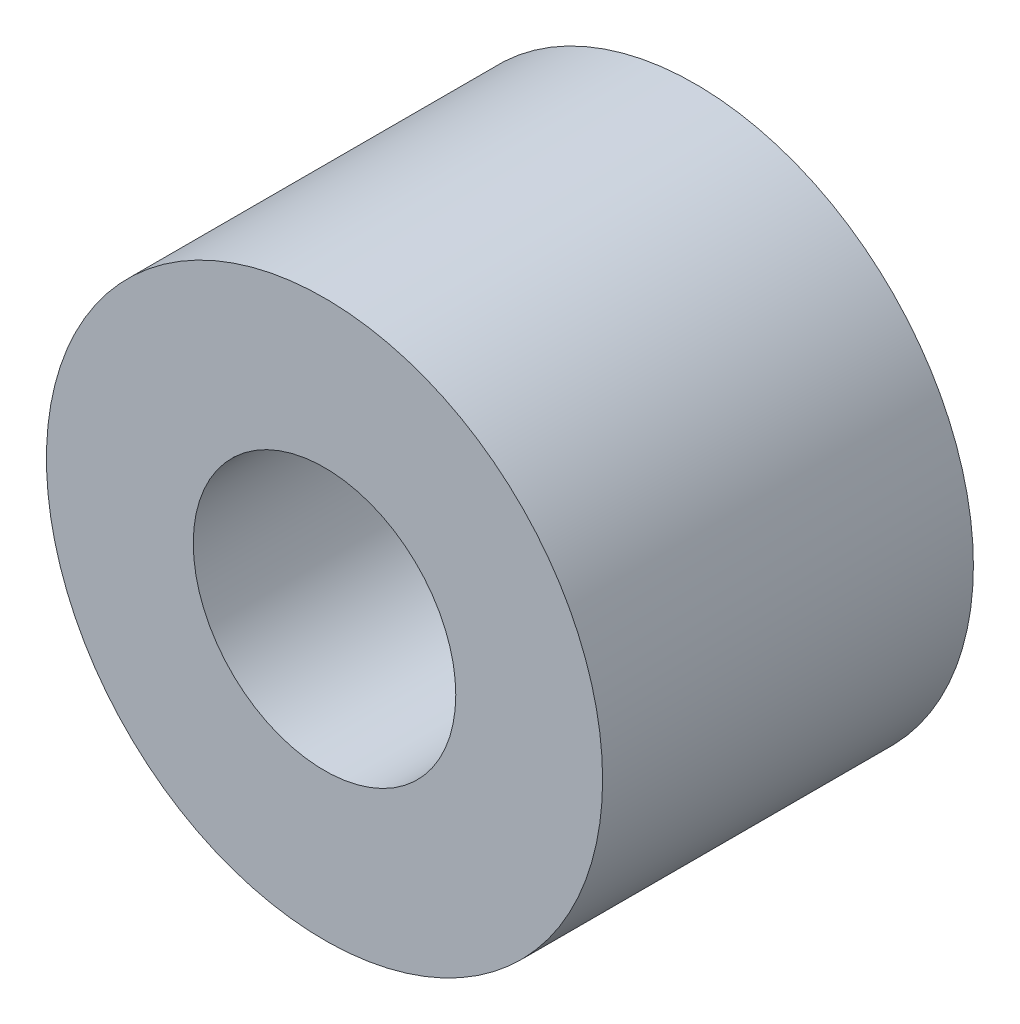
ISO-10303-21;
HEADER;
FILE_DESCRIPTION(('STEP AP214'),'2;1');
FILE_NAME('part.step','',(''),(''),'','','');
FILE_SCHEMA(('AUTOMOTIVE_DESIGN { 1 0 10303 214 1 1 1 1 }'));
ENDSEC;
DATA;
#1=APPLICATION_CONTEXT('core data for automotive mechanical design processes');
#2=APPLICATION_PROTOCOL_DEFINITION('international standard','automotive_design',2000,#1);
#3=PRODUCT_CONTEXT('',#1,'mechanical');
#4=PRODUCT('Part','Part','',(#3));
#5=PRODUCT_RELATED_PRODUCT_CATEGORY('part','',(#4));
#6=PRODUCT_DEFINITION_FORMATION('','',#4);
#7=PRODUCT_DEFINITION_CONTEXT('part definition',#1,'design');
#8=PRODUCT_DEFINITION('design','',#6,#7);
#9=PRODUCT_DEFINITION_SHAPE('','',#8);
#10=(LENGTH_UNIT() NAMED_UNIT(*) SI_UNIT(.MILLI.,.METRE.));
#11=(NAMED_UNIT(*) PLANE_ANGLE_UNIT() SI_UNIT($,.RADIAN.));
#12=(NAMED_UNIT(*) SI_UNIT($,.STERADIAN.) SOLID_ANGLE_UNIT());
#13=UNCERTAINTY_MEASURE_WITH_UNIT(LENGTH_MEASURE(1.E-05),#10,'distance_accuracy_value','');
#14=(GEOMETRIC_REPRESENTATION_CONTEXT(3) GLOBAL_UNCERTAINTY_ASSIGNED_CONTEXT((#13)) GLOBAL_UNIT_ASSIGNED_CONTEXT((#10,
#11,#12)) REPRESENTATION_CONTEXT('',''));
#15=CARTESIAN_POINT('',(0.,0.,0.));
#16=DIRECTION('',(0.,0.,1.));
#17=DIRECTION('',(1.,0.,0.));
#18=AXIS2_PLACEMENT_3D('',#15,#16,#17);
#19=CARTESIAN_POINT('',(0.,0.,6.35));
#20=DIRECTION('',(0.,0.,1.));
#21=DIRECTION('',(1.,0.,0.));
#22=AXIS2_PLACEMENT_3D('',#19,#20,#21);
#23=PLANE('',#22);
#24=CARTESIAN_POINT('',(0.,0.,6.35));
#25=DIRECTION('',(0.,0.,1.));
#26=DIRECTION('',(1.,0.,0.));
#27=AXIS2_PLACEMENT_3D('',#24,#25,#26);
#28=CIRCLE('',#27,4.7625);
#29=CARTESIAN_POINT('',(4.7625,0.,6.35));
#30=VERTEX_POINT('',#29);
#31=EDGE_CURVE('E10',#30,#30,#28,.T.);
#32=ORIENTED_EDGE('',*,*,#31,.T.);
#33=EDGE_LOOP('',(#32));
#34=FACE_BOUND('',#33,.T.);
#35=CARTESIAN_POINT('',(0.,0.,6.35));
#36=DIRECTION('',(0.,0.,1.));
#37=DIRECTION('',(1.,0.,0.));
#38=AXIS2_PLACEMENT_3D('',#35,#36,#37);
#39=CIRCLE('',#38,2.2479);
#40=CARTESIAN_POINT('',(2.2479,0.,6.35));
#41=VERTEX_POINT('',#40);
#42=EDGE_CURVE('E42',#41,#41,#39,.T.);
#43=ORIENTED_EDGE('',*,*,#42,.F.);
#44=EDGE_LOOP('',(#43));
#45=FACE_BOUND('',#44,.T.);
#46=ADVANCED_FACE('F31',(#34,#45),#23,.T.);
#47=CARTESIAN_POINT('',(0.,0.,0.));
#48=DIRECTION('',(0.,0.,1.));
#49=DIRECTION('',(1.,0.,0.));
#50=AXIS2_PLACEMENT_3D('',#47,#48,#49);
#51=PLANE('',#50);
#52=CARTESIAN_POINT('',(0.,0.,0.));
#53=DIRECTION('',(0.,0.,1.));
#54=DIRECTION('',(1.,0.,0.));
#55=AXIS2_PLACEMENT_3D('',#52,#53,#54);
#56=CIRCLE('',#55,4.7625);
#57=CARTESIAN_POINT('',(4.7625,0.,0.));
#58=VERTEX_POINT('',#57);
#59=EDGE_CURVE('E35',#58,#58,#56,.T.);
#60=ORIENTED_EDGE('',*,*,#59,.F.);
#61=EDGE_LOOP('',(#60));
#62=FACE_BOUND('',#61,.T.);
#63=CARTESIAN_POINT('',(0.,0.,0.));
#64=DIRECTION('',(0.,0.,1.));
#65=DIRECTION('',(1.,0.,0.));
#66=AXIS2_PLACEMENT_3D('',#63,#64,#65);
#67=CIRCLE('',#66,2.2479);
#68=CARTESIAN_POINT('',(2.2479,0.,0.));
#69=VERTEX_POINT('',#68);
#70=EDGE_CURVE('E44',#69,#69,#67,.T.);
#71=ORIENTED_EDGE('',*,*,#70,.T.);
#72=EDGE_LOOP('',(#71));
#73=FACE_BOUND('',#72,.T.);
#74=ADVANCED_FACE('F54',(#62,#73),#51,.F.);
#75=CARTESIAN_POINT('',(0.,0.,6.35));
#76=DIRECTION('',(0.,0.,-1.));
#77=DIRECTION('',(-1.,0.,0.));
#78=AXIS2_PLACEMENT_3D('',#75,#76,#77);
#79=CYLINDRICAL_SURFACE('',#78,4.7625);
#80=ORIENTED_EDGE('',*,*,#31,.F.);
#81=EDGE_LOOP('',(#80));
#82=FACE_BOUND('',#81,.T.);
#83=ORIENTED_EDGE('',*,*,#59,.T.);
#84=EDGE_LOOP('',(#83));
#85=FACE_BOUND('',#84,.T.);
#86=ADVANCED_FACE('F33',(#82,#85),#79,.T.);
#87=CARTESIAN_POINT('',(0.,0.,6.35));
#88=DIRECTION('',(0.,0.,-1.));
#89=DIRECTION('',(-1.,0.,0.));
#90=AXIS2_PLACEMENT_3D('',#87,#88,#89);
#91=CYLINDRICAL_SURFACE('',#90,2.2479);
#92=ORIENTED_EDGE('',*,*,#42,.T.);
#93=EDGE_LOOP('',(#92));
#94=FACE_BOUND('',#93,.T.);
#95=ORIENTED_EDGE('',*,*,#70,.F.);
#96=EDGE_LOOP('',(#95));
#97=FACE_BOUND('',#96,.T.);
#98=ADVANCED_FACE('F50',(#94,#97),#91,.F.);
#99=CLOSED_SHELL('',(#46,#74,#86,#98));
#100=MANIFOLD_SOLID_BREP('B2',#99);
#101=ADVANCED_BREP_SHAPE_REPRESENTATION('',(#18,#100),#14);
#102=SHAPE_DEFINITION_REPRESENTATION(#9,#101);
ENDSEC;
END-ISO-10303-21;
